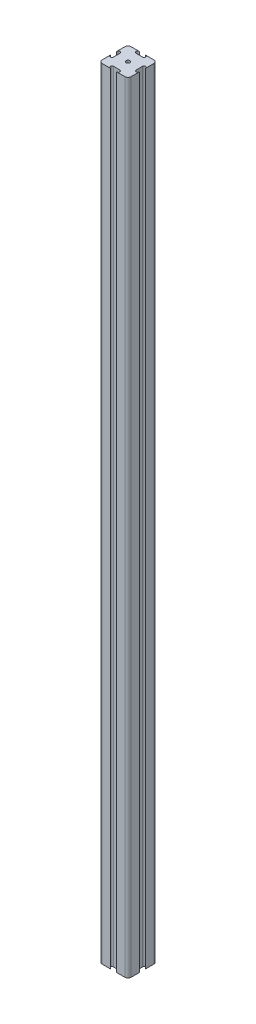
ISO-10303-21;
HEADER;
FILE_DESCRIPTION(('STEP AP214'),'2;1');
FILE_NAME('part.step','',(''),(''),'','','');
FILE_SCHEMA(('AUTOMOTIVE_DESIGN { 1 0 10303 214 1 1 1 1 }'));
ENDSEC;
DATA;
#1=APPLICATION_CONTEXT('core data for automotive mechanical design processes');
#2=APPLICATION_PROTOCOL_DEFINITION('international standard','automotive_design',2000,#1);
#3=PRODUCT_CONTEXT('',#1,'mechanical');
#4=PRODUCT('Part','Part','',(#3));
#5=PRODUCT_RELATED_PRODUCT_CATEGORY('part','',(#4));
#6=PRODUCT_DEFINITION_FORMATION('','',#4);
#7=PRODUCT_DEFINITION_CONTEXT('part definition',#1,'design');
#8=PRODUCT_DEFINITION('design','',#6,#7);
#9=PRODUCT_DEFINITION_SHAPE('','',#8);
#10=(LENGTH_UNIT() NAMED_UNIT(*) SI_UNIT(.MILLI.,.METRE.));
#11=(NAMED_UNIT(*) PLANE_ANGLE_UNIT() SI_UNIT($,.RADIAN.));
#12=(NAMED_UNIT(*) SI_UNIT($,.STERADIAN.) SOLID_ANGLE_UNIT());
#13=UNCERTAINTY_MEASURE_WITH_UNIT(LENGTH_MEASURE(1.E-05),#10,'distance_accuracy_value','');
#14=(GEOMETRIC_REPRESENTATION_CONTEXT(3) GLOBAL_UNCERTAINTY_ASSIGNED_CONTEXT((#13)) GLOBAL_UNIT_ASSIGNED_CONTEXT((#10,
#11,#12)) REPRESENTATION_CONTEXT('',''));
#15=CARTESIAN_POINT('',(0.,0.,0.));
#16=DIRECTION('',(0.,0.,1.));
#17=DIRECTION('',(1.,0.,0.));
#18=AXIS2_PLACEMENT_3D('',#15,#16,#17);
#19=CARTESIAN_POINT('',(-20.,1210.,5.));
#20=DIRECTION('',(0.,-1.,0.));
#21=DIRECTION('',(0.,0.,-1.));
#22=AXIS2_PLACEMENT_3D('',#19,#20,#21);
#23=CYLINDRICAL_SURFACE('',#22,2.5);
#24=CARTESIAN_POINT('',(-20.,0.,5.));
#25=DIRECTION('',(0.,-1.,0.));
#26=DIRECTION('',(0.,0.,-1.));
#27=AXIS2_PLACEMENT_3D('',#24,#25,#26);
#28=CIRCLE('',#27,2.5);
#29=CARTESIAN_POINT('',(-17.5,0.,5.));
#30=VERTEX_POINT('',#29);
#31=CARTESIAN_POINT('',(-22.5,0.,5.));
#32=VERTEX_POINT('',#31);
#33=EDGE_CURVE('E225',#30,#32,#28,.T.);
#34=ORIENTED_EDGE('',*,*,#33,.T.);
#35=DIRECTION('',(0.,-1.,0.));
#36=VECTOR('',#35,1.);
#37=CARTESIAN_POINT('',(-22.5,1210.,5.));
#38=LINE('',#37,#36);
#39=CARTESIAN_POINT('',(-22.5,1210.,5.));
#40=VERTEX_POINT('',#39);
#41=EDGE_CURVE('E11',#40,#32,#38,.T.);
#42=ORIENTED_EDGE('',*,*,#41,.F.);
#43=CARTESIAN_POINT('',(-20.,1210.,5.));
#44=DIRECTION('',(0.,-1.,0.));
#45=DIRECTION('',(0.,0.,-1.));
#46=AXIS2_PLACEMENT_3D('',#43,#44,#45);
#47=CIRCLE('',#46,2.5);
#48=CARTESIAN_POINT('',(-17.5,1210.,5.));
#49=VERTEX_POINT('',#48);
#50=EDGE_CURVE('E290',#49,#40,#47,.T.);
#51=ORIENTED_EDGE('',*,*,#50,.F.);
#52=DIRECTION('',(0.,-1.,0.));
#53=VECTOR('',#52,1.);
#54=CARTESIAN_POINT('',(-17.5,1210.,5.));
#55=LINE('',#54,#53);
#56=EDGE_CURVE('E221',#49,#30,#55,.T.);
#57=ORIENTED_EDGE('',*,*,#56,.T.);
#58=EDGE_LOOP('',(#34,#42,#51,#57));
#59=FACE_BOUND('',#58,.T.);
#60=ADVANCED_FACE('F33',(#59),#23,.F.);
#61=CARTESIAN_POINT('',(-22.5,1210.,5.));
#62=DIRECTION('',(1.,0.,0.));
#63=DIRECTION('',(0.,0.,-1.));
#64=AXIS2_PLACEMENT_3D('',#61,#62,#63);
#65=PLANE('',#64);
#66=DIRECTION('',(0.,0.,1.));
#67=VECTOR('',#66,1.);
#68=CARTESIAN_POINT('',(-22.5,0.,5.));
#69=LINE('',#68,#67);
#70=CARTESIAN_POINT('',(-22.5,0.,17.4999999999999));
#71=VERTEX_POINT('',#70);
#72=EDGE_CURVE('E228',#32,#71,#69,.T.);
#73=ORIENTED_EDGE('',*,*,#72,.T.);
#74=DIRECTION('',(0.,-1.,0.));
#75=VECTOR('',#74,1.);
#76=CARTESIAN_POINT('',(-22.5,1210.,17.4999999999999));
#77=LINE('',#76,#75);
#78=CARTESIAN_POINT('',(-22.5,1210.,17.4999999999999));
#79=VERTEX_POINT('',#78);
#80=EDGE_CURVE('E41',#79,#71,#77,.T.);
#81=ORIENTED_EDGE('',*,*,#80,.F.);
#82=DIRECTION('',(0.,0.,1.));
#83=VECTOR('',#82,1.);
#84=CARTESIAN_POINT('',(-22.5,1210.,5.));
#85=LINE('',#84,#83);
#86=EDGE_CURVE('E136',#40,#79,#85,.T.);
#87=ORIENTED_EDGE('',*,*,#86,.F.);
#88=ORIENTED_EDGE('',*,*,#41,.T.);
#89=EDGE_LOOP('',(#73,#81,#87,#88));
#90=FACE_BOUND('',#89,.T.);
#91=ADVANCED_FACE('F417',(#90),#65,.F.);
#92=CARTESIAN_POINT('',(-17.5,1210.,17.5));
#93=DIRECTION('',(0.,-1.,0.));
#94=DIRECTION('',(0.,0.,-1.));
#95=AXIS2_PLACEMENT_3D('',#92,#93,#94);
#96=CYLINDRICAL_SURFACE('',#95,5.);
#97=CARTESIAN_POINT('',(-17.5,0.,17.5));
#98=DIRECTION('',(0.,1.,0.));
#99=DIRECTION('',(0.,0.,1.));
#100=AXIS2_PLACEMENT_3D('',#97,#98,#99);
#101=CIRCLE('',#100,5.);
#102=CARTESIAN_POINT('',(-17.5,0.,22.5));
#103=VERTEX_POINT('',#102);
#104=EDGE_CURVE('E231',#71,#103,#101,.T.);
#105=ORIENTED_EDGE('',*,*,#104,.T.);
#106=DIRECTION('',(0.,-1.,0.));
#107=VECTOR('',#106,1.);
#108=CARTESIAN_POINT('',(-17.5,1210.,22.5));
#109=LINE('',#108,#107);
#110=CARTESIAN_POINT('',(-17.5,1210.,22.5));
#111=VERTEX_POINT('',#110);
#112=EDGE_CURVE('E329',#111,#103,#109,.T.);
#113=ORIENTED_EDGE('',*,*,#112,.F.);
#114=CARTESIAN_POINT('',(-17.5,1210.,17.5));
#115=DIRECTION('',(0.,1.,0.));
#116=DIRECTION('',(0.,0.,1.));
#117=AXIS2_PLACEMENT_3D('',#114,#115,#116);
#118=CIRCLE('',#117,5.);
#119=EDGE_CURVE('E336',#79,#111,#118,.T.);
#120=ORIENTED_EDGE('',*,*,#119,.F.);
#121=ORIENTED_EDGE('',*,*,#80,.T.);
#122=EDGE_LOOP('',(#105,#113,#120,#121));
#123=FACE_BOUND('',#122,.T.);
#124=ADVANCED_FACE('F334',(#123),#96,.T.);
#125=CARTESIAN_POINT('',(-4.99999999999998,1210.,22.5));
#126=DIRECTION('',(0.,0.,1.));
#127=DIRECTION('',(1.,0.,0.));
#128=AXIS2_PLACEMENT_3D('',#125,#126,#127);
#129=PLANE('',#128);
#130=DIRECTION('',(-1.,0.,0.));
#131=VECTOR('',#130,1.);
#132=CARTESIAN_POINT('',(-4.99999999999998,0.,22.5));
#133=LINE('',#132,#131);
#134=CARTESIAN_POINT('',(-4.99999999999998,0.,22.5));
#135=VERTEX_POINT('',#134);
#136=EDGE_CURVE('E234',#135,#103,#133,.T.);
#137=ORIENTED_EDGE('',*,*,#136,.F.);
#138=DIRECTION('',(0.,-1.,0.));
#139=VECTOR('',#138,1.);
#140=CARTESIAN_POINT('',(-4.99999999999998,1210.,22.5));
#141=LINE('',#140,#139);
#142=CARTESIAN_POINT('',(-4.99999999999998,1210.,22.5));
#143=VERTEX_POINT('',#142);
#144=EDGE_CURVE('E327',#143,#135,#141,.T.);
#145=ORIENTED_EDGE('',*,*,#144,.F.);
#146=DIRECTION('',(-1.,0.,0.));
#147=VECTOR('',#146,1.);
#148=CARTESIAN_POINT('',(-4.99999999999998,1210.,22.5));
#149=LINE('',#148,#147);
#150=EDGE_CURVE('E347',#143,#111,#149,.T.);
#151=ORIENTED_EDGE('',*,*,#150,.T.);
#152=ORIENTED_EDGE('',*,*,#112,.T.);
#153=EDGE_LOOP('',(#137,#145,#151,#152));
#154=FACE_BOUND('',#153,.T.);
#155=ADVANCED_FACE('F344',(#154),#129,.T.);
#156=CARTESIAN_POINT('',(-5.,1210.,20.));
#157=DIRECTION('',(0.,-1.,0.));
#158=DIRECTION('',(0.,0.,-1.));
#159=AXIS2_PLACEMENT_3D('',#156,#157,#158);
#160=CYLINDRICAL_SURFACE('',#159,2.5);
#161=CARTESIAN_POINT('',(-5.,0.,20.));
#162=DIRECTION('',(0.,1.,0.));
#163=DIRECTION('',(0.,0.,1.));
#164=AXIS2_PLACEMENT_3D('',#161,#162,#163);
#165=CIRCLE('',#164,2.5);
#166=CARTESIAN_POINT('',(-4.99999999999998,0.,17.5));
#167=VERTEX_POINT('',#166);
#168=EDGE_CURVE('E237',#167,#135,#165,.T.);
#169=ORIENTED_EDGE('',*,*,#168,.F.);
#170=DIRECTION('',(0.,-1.,0.));
#171=VECTOR('',#170,1.);
#172=CARTESIAN_POINT('',(-4.99999999999998,1210.,17.5));
#173=LINE('',#172,#171);
#174=CARTESIAN_POINT('',(-4.99999999999998,1210.,17.5));
#175=VERTEX_POINT('',#174);
#176=EDGE_CURVE('E325',#175,#167,#173,.T.);
#177=ORIENTED_EDGE('',*,*,#176,.F.);
#178=CARTESIAN_POINT('',(-5.,1210.,20.));
#179=DIRECTION('',(0.,1.,0.));
#180=DIRECTION('',(0.,0.,1.));
#181=AXIS2_PLACEMENT_3D('',#178,#179,#180);
#182=CIRCLE('',#181,2.5);
#183=EDGE_CURVE('E350',#175,#143,#182,.T.);
#184=ORIENTED_EDGE('',*,*,#183,.T.);
#185=ORIENTED_EDGE('',*,*,#144,.T.);
#186=EDGE_LOOP('',(#169,#177,#184,#185));
#187=FACE_BOUND('',#186,.T.);
#188=ADVANCED_FACE('F624',(#187),#160,.F.);
#189=CARTESIAN_POINT('',(-4.99999999999998,1210.,17.5));
#190=DIRECTION('',(0.,0.,-1.));
#191=DIRECTION('',(-1.,0.,0.));
#192=AXIS2_PLACEMENT_3D('',#189,#190,#191);
#193=PLANE('',#192);
#194=DIRECTION('',(1.,0.,0.));
#195=VECTOR('',#194,1.);
#196=CARTESIAN_POINT('',(-4.99999999999998,0.,17.5));
#197=LINE('',#196,#195);
#198=CARTESIAN_POINT('',(5.00000000000002,0.,17.5));
#199=VERTEX_POINT('',#198);
#200=EDGE_CURVE('E240',#167,#199,#197,.T.);
#201=ORIENTED_EDGE('',*,*,#200,.T.);
#202=DIRECTION('',(0.,-1.,0.));
#203=VECTOR('',#202,1.);
#204=CARTESIAN_POINT('',(5.00000000000002,1210.,17.5));
#205=LINE('',#204,#203);
#206=CARTESIAN_POINT('',(5.00000000000002,1210.,17.5));
#207=VERTEX_POINT('',#206);
#208=EDGE_CURVE('E323',#207,#199,#205,.T.);
#209=ORIENTED_EDGE('',*,*,#208,.F.);
#210=DIRECTION('',(1.,0.,0.));
#211=VECTOR('',#210,1.);
#212=CARTESIAN_POINT('',(-4.99999999999998,1210.,17.5));
#213=LINE('',#212,#211);
#214=EDGE_CURVE('E352',#175,#207,#213,.T.);
#215=ORIENTED_EDGE('',*,*,#214,.F.);
#216=ORIENTED_EDGE('',*,*,#176,.T.);
#217=EDGE_LOOP('',(#201,#209,#215,#216));
#218=FACE_BOUND('',#217,.T.);
#219=ADVANCED_FACE('F614',(#218),#193,.F.);
#220=CARTESIAN_POINT('',(4.99999999999996,1210.,20.));
#221=DIRECTION('',(0.,-1.,0.));
#222=DIRECTION('',(0.,0.,-1.));
#223=AXIS2_PLACEMENT_3D('',#220,#221,#222);
#224=CYLINDRICAL_SURFACE('',#223,2.50000000000001);
#225=CARTESIAN_POINT('',(4.99999999999996,0.,20.));
#226=DIRECTION('',(0.,1.,0.));
#227=DIRECTION('',(0.,0.,1.));
#228=AXIS2_PLACEMENT_3D('',#225,#226,#227);
#229=CIRCLE('',#228,2.50000000000001);
#230=CARTESIAN_POINT('',(4.99999999999996,0.,22.5));
#231=VERTEX_POINT('',#230);
#232=EDGE_CURVE('E243',#231,#199,#229,.T.);
#233=ORIENTED_EDGE('',*,*,#232,.F.);
#234=DIRECTION('',(0.,-1.,0.));
#235=VECTOR('',#234,1.);
#236=CARTESIAN_POINT('',(4.99999999999996,1210.,22.5));
#237=LINE('',#236,#235);
#238=CARTESIAN_POINT('',(4.99999999999996,1210.,22.5));
#239=VERTEX_POINT('',#238);
#240=EDGE_CURVE('E321',#239,#231,#237,.T.);
#241=ORIENTED_EDGE('',*,*,#240,.F.);
#242=CARTESIAN_POINT('',(4.99999999999996,1210.,20.));
#243=DIRECTION('',(0.,1.,0.));
#244=DIRECTION('',(0.,0.,1.));
#245=AXIS2_PLACEMENT_3D('',#242,#243,#244);
#246=CIRCLE('',#245,2.50000000000001);
#247=EDGE_CURVE('E358',#239,#207,#246,.T.);
#248=ORIENTED_EDGE('',*,*,#247,.T.);
#249=ORIENTED_EDGE('',*,*,#208,.T.);
#250=EDGE_LOOP('',(#233,#241,#248,#249));
#251=FACE_BOUND('',#250,.T.);
#252=ADVANCED_FACE('F604',(#251),#224,.F.);
#253=CARTESIAN_POINT('',(4.99999999999996,1210.,22.5));
#254=DIRECTION('',(0.,0.,-1.));
#255=DIRECTION('',(-1.,0.,0.));
#256=AXIS2_PLACEMENT_3D('',#253,#254,#255);
#257=PLANE('',#256);
#258=DIRECTION('',(1.,0.,0.));
#259=VECTOR('',#258,1.);
#260=CARTESIAN_POINT('',(4.99999999999996,0.,22.5));
#261=LINE('',#260,#259);
#262=CARTESIAN_POINT('',(17.5,0.,22.5));
#263=VERTEX_POINT('',#262);
#264=EDGE_CURVE('E246',#231,#263,#261,.T.);
#265=ORIENTED_EDGE('',*,*,#264,.T.);
#266=DIRECTION('',(0.,-1.,0.));
#267=VECTOR('',#266,1.);
#268=CARTESIAN_POINT('',(17.5,1210.,22.5));
#269=LINE('',#268,#267);
#270=CARTESIAN_POINT('',(17.5,1210.,22.5));
#271=VERTEX_POINT('',#270);
#272=EDGE_CURVE('E318',#271,#263,#269,.T.);
#273=ORIENTED_EDGE('',*,*,#272,.F.);
#274=DIRECTION('',(1.,0.,0.));
#275=VECTOR('',#274,1.);
#276=CARTESIAN_POINT('',(4.99999999999996,1210.,22.5));
#277=LINE('',#276,#275);
#278=EDGE_CURVE('E361',#239,#271,#277,.T.);
#279=ORIENTED_EDGE('',*,*,#278,.F.);
#280=ORIENTED_EDGE('',*,*,#240,.T.);
#281=EDGE_LOOP('',(#265,#273,#279,#280));
#282=FACE_BOUND('',#281,.T.);
#283=ADVANCED_FACE('F594',(#282),#257,.F.);
#284=CARTESIAN_POINT('',(17.5000000000006,1210.,17.5));
#285=DIRECTION('',(0.,-1.,0.));
#286=DIRECTION('',(0.,0.,-1.));
#287=AXIS2_PLACEMENT_3D('',#284,#285,#286);
#288=CYLINDRICAL_SURFACE('',#287,5.);
#289=CARTESIAN_POINT('',(17.5000000000006,0.,17.5));
#290=DIRECTION('',(0.,1.,0.));
#291=DIRECTION('',(0.,0.,1.));
#292=AXIS2_PLACEMENT_3D('',#289,#290,#291);
#293=CIRCLE('',#292,5.);
#294=CARTESIAN_POINT('',(22.5,0.,17.5000025246919));
#295=VERTEX_POINT('',#294);
#296=EDGE_CURVE('E248',#263,#295,#293,.T.);
#297=ORIENTED_EDGE('',*,*,#296,.T.);
#298=DIRECTION('',(0.,-1.,0.));
#299=VECTOR('',#298,1.);
#300=CARTESIAN_POINT('',(22.5,1210.,17.5000025246919));
#301=LINE('',#300,#299);
#302=CARTESIAN_POINT('',(22.5,1210.,17.5000025246919));
#303=VERTEX_POINT('',#302);
#304=EDGE_CURVE('E316',#303,#295,#301,.T.);
#305=ORIENTED_EDGE('',*,*,#304,.F.);
#306=CARTESIAN_POINT('',(17.5000000000006,1210.,17.5));
#307=DIRECTION('',(0.,1.,0.));
#308=DIRECTION('',(0.,0.,1.));
#309=AXIS2_PLACEMENT_3D('',#306,#307,#308);
#310=CIRCLE('',#309,5.);
#311=EDGE_CURVE('E363',#271,#303,#310,.T.);
#312=ORIENTED_EDGE('',*,*,#311,.F.);
#313=ORIENTED_EDGE('',*,*,#272,.T.);
#314=EDGE_LOOP('',(#297,#305,#312,#313));
#315=FACE_BOUND('',#314,.T.);
#316=ADVANCED_FACE('F584',(#315),#288,.T.);
#317=CARTESIAN_POINT('',(22.5,1210.,5.00000252469196));
#318=DIRECTION('',(1.,0.,0.));
#319=DIRECTION('',(0.,0.,-1.));
#320=AXIS2_PLACEMENT_3D('',#317,#318,#319);
#321=PLANE('',#320);
#322=DIRECTION('',(0.,0.,1.));
#323=VECTOR('',#322,1.);
#324=CARTESIAN_POINT('',(22.5,0.,5.00000252469196));
#325=LINE('',#324,#323);
#326=CARTESIAN_POINT('',(22.5,0.,5.00000252469196));
#327=VERTEX_POINT('',#326);
#328=EDGE_CURVE('E251',#327,#295,#325,.T.);
#329=ORIENTED_EDGE('',*,*,#328,.F.);
#330=DIRECTION('',(0.,-1.,0.));
#331=VECTOR('',#330,1.);
#332=CARTESIAN_POINT('',(22.5,1210.,5.00000252469196));
#333=LINE('',#332,#331);
#334=CARTESIAN_POINT('',(22.5,1210.,5.00000252469196));
#335=VERTEX_POINT('',#334);
#336=EDGE_CURVE('E314',#335,#327,#333,.T.);
#337=ORIENTED_EDGE('',*,*,#336,.F.);
#338=DIRECTION('',(0.,0.,1.));
#339=VECTOR('',#338,1.);
#340=CARTESIAN_POINT('',(22.5,1210.,5.00000252469196));
#341=LINE('',#340,#339);
#342=EDGE_CURVE('E365',#335,#303,#341,.T.);
#343=ORIENTED_EDGE('',*,*,#342,.T.);
#344=ORIENTED_EDGE('',*,*,#304,.T.);
#345=EDGE_LOOP('',(#329,#337,#343,#344));
#346=FACE_BOUND('',#345,.T.);
#347=ADVANCED_FACE('F574',(#346),#321,.T.);
#348=CARTESIAN_POINT('',(20.,1210.,5.00000252469196));
#349=DIRECTION('',(0.,-1.,0.));
#350=DIRECTION('',(0.,0.,-1.));
#351=AXIS2_PLACEMENT_3D('',#348,#349,#350);
#352=CYLINDRICAL_SURFACE('',#351,2.5);
#353=CARTESIAN_POINT('',(20.,0.,5.00000252469196));
#354=DIRECTION('',(0.,-1.,0.));
#355=DIRECTION('',(0.,0.,-1.));
#356=AXIS2_PLACEMENT_3D('',#353,#354,#355);
#357=CIRCLE('',#356,2.5);
#358=CARTESIAN_POINT('',(17.5,0.,5.00000252469196));
#359=VERTEX_POINT('',#358);
#360=EDGE_CURVE('E254',#327,#359,#357,.T.);
#361=ORIENTED_EDGE('',*,*,#360,.T.);
#362=DIRECTION('',(0.,-1.,0.));
#363=VECTOR('',#362,1.);
#364=CARTESIAN_POINT('',(17.5,1210.,5.00000252469196));
#365=LINE('',#364,#363);
#366=CARTESIAN_POINT('',(17.5,1210.,5.00000252469196));
#367=VERTEX_POINT('',#366);
#368=EDGE_CURVE('E312',#367,#359,#365,.T.);
#369=ORIENTED_EDGE('',*,*,#368,.F.);
#370=CARTESIAN_POINT('',(20.,1210.,5.00000252469196));
#371=DIRECTION('',(0.,-1.,0.));
#372=DIRECTION('',(0.,0.,-1.));
#373=AXIS2_PLACEMENT_3D('',#370,#371,#372);
#374=CIRCLE('',#373,2.5);
#375=EDGE_CURVE('E368',#335,#367,#374,.T.);
#376=ORIENTED_EDGE('',*,*,#375,.F.);
#377=ORIENTED_EDGE('',*,*,#336,.T.);
#378=EDGE_LOOP('',(#361,#369,#376,#377));
#379=FACE_BOUND('',#378,.T.);
#380=ADVANCED_FACE('F564',(#379),#352,.F.);
#381=CARTESIAN_POINT('',(17.5,1210.,-4.99999747530804));
#382=DIRECTION('',(1.,0.,0.));
#383=DIRECTION('',(0.,0.,-1.));
#384=AXIS2_PLACEMENT_3D('',#381,#382,#383);
#385=PLANE('',#384);
#386=DIRECTION('',(0.,0.,1.));
#387=VECTOR('',#386,1.);
#388=CARTESIAN_POINT('',(17.5,0.,-4.99999747530804));
#389=LINE('',#388,#387);
#390=CARTESIAN_POINT('',(17.5,0.,-4.99999747530804));
#391=VERTEX_POINT('',#390);
#392=EDGE_CURVE('E257',#391,#359,#389,.T.);
#393=ORIENTED_EDGE('',*,*,#392,.F.);
#394=DIRECTION('',(0.,-1.,0.));
#395=VECTOR('',#394,1.);
#396=CARTESIAN_POINT('',(17.5,1210.,-4.99999747530804));
#397=LINE('',#396,#395);
#398=CARTESIAN_POINT('',(17.5,1210.,-4.99999747530804));
#399=VERTEX_POINT('',#398);
#400=EDGE_CURVE('E310',#399,#391,#397,.T.);
#401=ORIENTED_EDGE('',*,*,#400,.F.);
#402=DIRECTION('',(0.,0.,1.));
#403=VECTOR('',#402,1.);
#404=CARTESIAN_POINT('',(17.5,1210.,-4.99999747530804));
#405=LINE('',#404,#403);
#406=EDGE_CURVE('E370',#399,#367,#405,.T.);
#407=ORIENTED_EDGE('',*,*,#406,.T.);
#408=ORIENTED_EDGE('',*,*,#368,.T.);
#409=EDGE_LOOP('',(#393,#401,#407,#408));
#410=FACE_BOUND('',#409,.T.);
#411=ADVANCED_FACE('F554',(#410),#385,.T.);
#412=CARTESIAN_POINT('',(20.,1210.,-4.99999747530804));
#413=DIRECTION('',(0.,-1.,0.));
#414=DIRECTION('',(0.,0.,-1.));
#415=AXIS2_PLACEMENT_3D('',#412,#413,#414);
#416=CYLINDRICAL_SURFACE('',#415,2.5);
#417=CARTESIAN_POINT('',(20.,0.,-4.99999747530804));
#418=DIRECTION('',(0.,1.,0.));
#419=DIRECTION('',(0.,0.,1.));
#420=AXIS2_PLACEMENT_3D('',#417,#418,#419);
#421=CIRCLE('',#420,2.5);
#422=CARTESIAN_POINT('',(22.5,0.,-4.99999747530804));
#423=VERTEX_POINT('',#422);
#424=EDGE_CURVE('E260',#423,#391,#421,.T.);
#425=ORIENTED_EDGE('',*,*,#424,.F.);
#426=DIRECTION('',(0.,-1.,0.));
#427=VECTOR('',#426,1.);
#428=CARTESIAN_POINT('',(22.5,1210.,-4.99999747530804));
#429=LINE('',#428,#427);
#430=CARTESIAN_POINT('',(22.5,1210.,-4.99999747530804));
#431=VERTEX_POINT('',#430);
#432=EDGE_CURVE('E308',#431,#423,#429,.T.);
#433=ORIENTED_EDGE('',*,*,#432,.F.);
#434=CARTESIAN_POINT('',(20.,1210.,-4.99999747530804));
#435=DIRECTION('',(0.,1.,0.));
#436=DIRECTION('',(0.,0.,1.));
#437=AXIS2_PLACEMENT_3D('',#434,#435,#436);
#438=CIRCLE('',#437,2.5);
#439=EDGE_CURVE('E373',#431,#399,#438,.T.);
#440=ORIENTED_EDGE('',*,*,#439,.T.);
#441=ORIENTED_EDGE('',*,*,#400,.T.);
#442=EDGE_LOOP('',(#425,#433,#440,#441));
#443=FACE_BOUND('',#442,.T.);
#444=ADVANCED_FACE('F544',(#443),#416,.F.);
#445=CARTESIAN_POINT('',(22.5,1210.,-4.99999747530804));
#446=DIRECTION('',(-1.,0.,0.));
#447=DIRECTION('',(0.,0.,1.));
#448=AXIS2_PLACEMENT_3D('',#445,#446,#447);
#449=PLANE('',#448);
#450=DIRECTION('',(0.,0.,-1.));
#451=VECTOR('',#450,1.);
#452=CARTESIAN_POINT('',(22.5,0.,-4.99999747530804));
#453=LINE('',#452,#451);
#454=CARTESIAN_POINT('',(22.5,0.,-17.499997475308));
#455=VERTEX_POINT('',#454);
#456=EDGE_CURVE('E263',#423,#455,#453,.T.);
#457=ORIENTED_EDGE('',*,*,#456,.T.);
#458=DIRECTION('',(0.,-1.,0.));
#459=VECTOR('',#458,1.);
#460=CARTESIAN_POINT('',(22.5,1210.,-17.499997475308));
#461=LINE('',#460,#459);
#462=CARTESIAN_POINT('',(22.5,1210.,-17.499997475308));
#463=VERTEX_POINT('',#462);
#464=EDGE_CURVE('E306',#463,#455,#461,.T.);
#465=ORIENTED_EDGE('',*,*,#464,.F.);
#466=DIRECTION('',(0.,0.,-1.));
#467=VECTOR('',#466,1.);
#468=CARTESIAN_POINT('',(22.5,1210.,-4.99999747530804));
#469=LINE('',#468,#467);
#470=EDGE_CURVE('E376',#431,#463,#469,.T.);
#471=ORIENTED_EDGE('',*,*,#470,.F.);
#472=ORIENTED_EDGE('',*,*,#432,.T.);
#473=EDGE_LOOP('',(#457,#465,#471,#472));
#474=FACE_BOUND('',#473,.T.);
#475=ADVANCED_FACE('F534',(#474),#449,.F.);
#476=CARTESIAN_POINT('',(17.5000000000006,1210.,-17.5));
#477=DIRECTION('',(0.,-1.,0.));
#478=DIRECTION('',(0.,0.,-1.));
#479=AXIS2_PLACEMENT_3D('',#476,#477,#478);
#480=CYLINDRICAL_SURFACE('',#479,5.00000000000001);
#481=CARTESIAN_POINT('',(17.5000000000006,0.,-17.5));
#482=DIRECTION('',(0.,-1.,0.));
#483=DIRECTION('',(0.,0.,-1.));
#484=AXIS2_PLACEMENT_3D('',#481,#482,#483);
#485=CIRCLE('',#484,5.00000000000001);
#486=CARTESIAN_POINT('',(17.5,0.,-22.5));
#487=VERTEX_POINT('',#486);
#488=EDGE_CURVE('E266',#487,#455,#485,.T.);
#489=ORIENTED_EDGE('',*,*,#488,.F.);
#490=DIRECTION('',(0.,-1.,0.));
#491=VECTOR('',#490,1.);
#492=CARTESIAN_POINT('',(17.5,1210.,-22.5));
#493=LINE('',#492,#491);
#494=CARTESIAN_POINT('',(17.5,1210.,-22.5));
#495=VERTEX_POINT('',#494);
#496=EDGE_CURVE('E304',#495,#487,#493,.T.);
#497=ORIENTED_EDGE('',*,*,#496,.F.);
#498=CARTESIAN_POINT('',(17.5000000000006,1210.,-17.5));
#499=DIRECTION('',(0.,-1.,0.));
#500=DIRECTION('',(0.,0.,-1.));
#501=AXIS2_PLACEMENT_3D('',#498,#499,#500);
#502=CIRCLE('',#501,5.00000000000001);
#503=EDGE_CURVE('E378',#495,#463,#502,.T.);
#504=ORIENTED_EDGE('',*,*,#503,.T.);
#505=ORIENTED_EDGE('',*,*,#464,.T.);
#506=EDGE_LOOP('',(#489,#497,#504,#505));
#507=FACE_BOUND('',#506,.T.);
#508=ADVANCED_FACE('F524',(#507),#480,.T.);
#509=CARTESIAN_POINT('',(5.00000000000003,1210.,-22.5));
#510=DIRECTION('',(0.,0.,-1.));
#511=DIRECTION('',(-1.,0.,0.));
#512=AXIS2_PLACEMENT_3D('',#509,#510,#511);
#513=PLANE('',#512);
#514=DIRECTION('',(1.,0.,0.));
#515=VECTOR('',#514,1.);
#516=CARTESIAN_POINT('',(5.00000000000003,0.,-22.5));
#517=LINE('',#516,#515);
#518=CARTESIAN_POINT('',(5.00000000000003,0.,-22.5));
#519=VERTEX_POINT('',#518);
#520=EDGE_CURVE('E269',#519,#487,#517,.T.);
#521=ORIENTED_EDGE('',*,*,#520,.F.);
#522=DIRECTION('',(0.,-1.,0.));
#523=VECTOR('',#522,1.);
#524=CARTESIAN_POINT('',(5.00000000000003,1210.,-22.5));
#525=LINE('',#524,#523);
#526=CARTESIAN_POINT('',(5.00000000000003,1210.,-22.5));
#527=VERTEX_POINT('',#526);
#528=EDGE_CURVE('E302',#527,#519,#525,.T.);
#529=ORIENTED_EDGE('',*,*,#528,.F.);
#530=DIRECTION('',(1.,0.,0.));
#531=VECTOR('',#530,1.);
#532=CARTESIAN_POINT('',(5.00000000000003,1210.,-22.5));
#533=LINE('',#532,#531);
#534=EDGE_CURVE('E381',#527,#495,#533,.T.);
#535=ORIENTED_EDGE('',*,*,#534,.T.);
#536=ORIENTED_EDGE('',*,*,#496,.T.);
#537=EDGE_LOOP('',(#521,#529,#535,#536));
#538=FACE_BOUND('',#537,.T.);
#539=ADVANCED_FACE('F514',(#538),#513,.T.);
#540=CARTESIAN_POINT('',(5.00000000000003,1210.,-20.));
#541=DIRECTION('',(0.,-1.,0.));
#542=DIRECTION('',(0.,0.,-1.));
#543=AXIS2_PLACEMENT_3D('',#540,#541,#542);
#544=CYLINDRICAL_SURFACE('',#543,2.50000000000001);
#545=CARTESIAN_POINT('',(5.00000000000003,0.,-20.));
#546=DIRECTION('',(0.,1.,0.));
#547=DIRECTION('',(0.,0.,1.));
#548=AXIS2_PLACEMENT_3D('',#545,#546,#547);
#549=CIRCLE('',#548,2.50000000000001);
#550=CARTESIAN_POINT('',(5.00000000000001,0.,-17.5));
#551=VERTEX_POINT('',#550);
#552=EDGE_CURVE('E272',#551,#519,#549,.T.);
#553=ORIENTED_EDGE('',*,*,#552,.F.);
#554=DIRECTION('',(0.,-1.,0.));
#555=VECTOR('',#554,1.);
#556=CARTESIAN_POINT('',(5.00000000000001,1210.,-17.5));
#557=LINE('',#556,#555);
#558=CARTESIAN_POINT('',(5.00000000000001,1210.,-17.5));
#559=VERTEX_POINT('',#558);
#560=EDGE_CURVE('E300',#559,#551,#557,.T.);
#561=ORIENTED_EDGE('',*,*,#560,.F.);
#562=CARTESIAN_POINT('',(5.00000000000003,1210.,-20.));
#563=DIRECTION('',(0.,1.,0.));
#564=DIRECTION('',(0.,0.,1.));
#565=AXIS2_PLACEMENT_3D('',#562,#563,#564);
#566=CIRCLE('',#565,2.50000000000001);
#567=EDGE_CURVE('E384',#559,#527,#566,.T.);
#568=ORIENTED_EDGE('',*,*,#567,.T.);
#569=ORIENTED_EDGE('',*,*,#528,.T.);
#570=EDGE_LOOP('',(#553,#561,#568,#569));
#571=FACE_BOUND('',#570,.T.);
#572=ADVANCED_FACE('F504',(#571),#544,.F.);
#573=CARTESIAN_POINT('',(-5.,1210.,-17.5));
#574=DIRECTION('',(0.,0.,-1.));
#575=DIRECTION('',(-1.,0.,0.));
#576=AXIS2_PLACEMENT_3D('',#573,#574,#575);
#577=PLANE('',#576);
#578=DIRECTION('',(1.,0.,0.));
#579=VECTOR('',#578,1.);
#580=CARTESIAN_POINT('',(-5.,0.,-17.5));
#581=LINE('',#580,#579);
#582=CARTESIAN_POINT('',(-5.,0.,-17.5));
#583=VERTEX_POINT('',#582);
#584=EDGE_CURVE('E275',#583,#551,#581,.T.);
#585=ORIENTED_EDGE('',*,*,#584,.F.);
#586=DIRECTION('',(0.,-1.,0.));
#587=VECTOR('',#586,1.);
#588=CARTESIAN_POINT('',(-5.,1210.,-17.5));
#589=LINE('',#588,#587);
#590=CARTESIAN_POINT('',(-5.,1210.,-17.5));
#591=VERTEX_POINT('',#590);
#592=EDGE_CURVE('E298',#591,#583,#589,.T.);
#593=ORIENTED_EDGE('',*,*,#592,.F.);
#594=DIRECTION('',(1.,0.,0.));
#595=VECTOR('',#594,1.);
#596=CARTESIAN_POINT('',(-5.,1210.,-17.5));
#597=LINE('',#596,#595);
#598=EDGE_CURVE('E387',#591,#559,#597,.T.);
#599=ORIENTED_EDGE('',*,*,#598,.T.);
#600=ORIENTED_EDGE('',*,*,#560,.T.);
#601=EDGE_LOOP('',(#585,#593,#599,#600));
#602=FACE_BOUND('',#601,.T.);
#603=ADVANCED_FACE('F495',(#602),#577,.T.);
#604=CARTESIAN_POINT('',(-5.00000000000003,1210.,-20.));
#605=DIRECTION('',(0.,-1.,0.));
#606=DIRECTION('',(0.,0.,-1.));
#607=AXIS2_PLACEMENT_3D('',#604,#605,#606);
#608=CYLINDRICAL_SURFACE('',#607,2.5);
#609=CARTESIAN_POINT('',(-5.00000000000003,0.,-20.));
#610=DIRECTION('',(0.,1.,0.));
#611=DIRECTION('',(0.,0.,1.));
#612=AXIS2_PLACEMENT_3D('',#609,#610,#611);
#613=CIRCLE('',#612,2.5);
#614=CARTESIAN_POINT('',(-5.00000000000003,0.,-22.5));
#615=VERTEX_POINT('',#614);
#616=EDGE_CURVE('E278',#615,#583,#613,.T.);
#617=ORIENTED_EDGE('',*,*,#616,.F.);
#618=DIRECTION('',(0.,-1.,0.));
#619=VECTOR('',#618,1.);
#620=CARTESIAN_POINT('',(-5.00000000000003,1210.,-22.5));
#621=LINE('',#620,#619);
#622=CARTESIAN_POINT('',(-5.00000000000003,1210.,-22.5));
#623=VERTEX_POINT('',#622);
#624=EDGE_CURVE('E296',#623,#615,#621,.T.);
#625=ORIENTED_EDGE('',*,*,#624,.F.);
#626=CARTESIAN_POINT('',(-5.00000000000003,1210.,-20.));
#627=DIRECTION('',(0.,1.,0.));
#628=DIRECTION('',(0.,0.,1.));
#629=AXIS2_PLACEMENT_3D('',#626,#627,#628);
#630=CIRCLE('',#629,2.5);
#631=EDGE_CURVE('E390',#623,#591,#630,.T.);
#632=ORIENTED_EDGE('',*,*,#631,.T.);
#633=ORIENTED_EDGE('',*,*,#592,.T.);
#634=EDGE_LOOP('',(#617,#625,#632,#633));
#635=FACE_BOUND('',#634,.T.);
#636=ADVANCED_FACE('F403',(#635),#608,.F.);
#637=CARTESIAN_POINT('',(-17.5,1210.,-22.5));
#638=DIRECTION('',(0.,0.,-1.));
#639=DIRECTION('',(-1.,0.,0.));
#640=AXIS2_PLACEMENT_3D('',#637,#638,#639);
#641=PLANE('',#640);
#642=DIRECTION('',(1.,0.,0.));
#643=VECTOR('',#642,1.);
#644=CARTESIAN_POINT('',(-17.5,0.,-22.5));
#645=LINE('',#644,#643);
#646=CARTESIAN_POINT('',(-17.5,0.,-22.5));
#647=VERTEX_POINT('',#646);
#648=EDGE_CURVE('E281',#647,#615,#645,.T.);
#649=ORIENTED_EDGE('',*,*,#648,.F.);
#650=DIRECTION('',(0.,-1.,0.));
#651=VECTOR('',#650,1.);
#652=CARTESIAN_POINT('',(-17.5,1210.,-22.5));
#653=LINE('',#652,#651);
#654=CARTESIAN_POINT('',(-17.5,1210.,-22.5));
#655=VERTEX_POINT('',#654);
#656=EDGE_CURVE('E294',#655,#647,#653,.T.);
#657=ORIENTED_EDGE('',*,*,#656,.F.);
#658=DIRECTION('',(1.,0.,0.));
#659=VECTOR('',#658,1.);
#660=CARTESIAN_POINT('',(-17.5,1210.,-22.5));
#661=LINE('',#660,#659);
#662=EDGE_CURVE('E393',#655,#623,#661,.T.);
#663=ORIENTED_EDGE('',*,*,#662,.T.);
#664=ORIENTED_EDGE('',*,*,#624,.T.);
#665=EDGE_LOOP('',(#649,#657,#663,#664));
#666=FACE_BOUND('',#665,.T.);
#667=ADVANCED_FACE('F397',(#666),#641,.T.);
#668=CARTESIAN_POINT('',(-17.5,1210.,-17.5));
#669=DIRECTION('',(0.,-1.,0.));
#670=DIRECTION('',(0.,0.,-1.));
#671=AXIS2_PLACEMENT_3D('',#668,#669,#670);
#672=CYLINDRICAL_SURFACE('',#671,5.00000000000001);
#673=CARTESIAN_POINT('',(-17.5,0.,-17.5));
#674=DIRECTION('',(0.,1.,0.));
#675=DIRECTION('',(0.,0.,1.));
#676=AXIS2_PLACEMENT_3D('',#673,#674,#675);
#677=CIRCLE('',#676,5.00000000000001);
#678=CARTESIAN_POINT('',(-22.5,0.,-17.5));
#679=VERTEX_POINT('',#678);
#680=EDGE_CURVE('E284',#647,#679,#677,.T.);
#681=ORIENTED_EDGE('',*,*,#680,.T.);
#682=DIRECTION('',(0.,-1.,0.));
#683=VECTOR('',#682,1.);
#684=CARTESIAN_POINT('',(-22.5,1210.,-17.5));
#685=LINE('',#684,#683);
#686=CARTESIAN_POINT('',(-22.5,1210.,-17.5));
#687=VERTEX_POINT('',#686);
#688=EDGE_CURVE('E217',#687,#679,#685,.T.);
#689=ORIENTED_EDGE('',*,*,#688,.F.);
#690=CARTESIAN_POINT('',(-17.5,1210.,-17.5));
#691=DIRECTION('',(0.,1.,0.));
#692=DIRECTION('',(0.,0.,1.));
#693=AXIS2_PLACEMENT_3D('',#690,#691,#692);
#694=CIRCLE('',#693,5.00000000000001);
#695=EDGE_CURVE('E204',#655,#687,#694,.T.);
#696=ORIENTED_EDGE('',*,*,#695,.F.);
#697=ORIENTED_EDGE('',*,*,#656,.T.);
#698=EDGE_LOOP('',(#681,#689,#696,#697));
#699=FACE_BOUND('',#698,.T.);
#700=ADVANCED_FACE('F407',(#699),#672,.T.);
#701=CARTESIAN_POINT('',(-22.5,1210.,-17.5));
#702=DIRECTION('',(1.,0.,0.));
#703=DIRECTION('',(0.,0.,-1.));
#704=AXIS2_PLACEMENT_3D('',#701,#702,#703);
#705=PLANE('',#704);
#706=DIRECTION('',(0.,0.,1.));
#707=VECTOR('',#706,1.);
#708=CARTESIAN_POINT('',(-22.5,0.,-17.5));
#709=LINE('',#708,#707);
#710=CARTESIAN_POINT('',(-22.5,0.,-5.));
#711=VERTEX_POINT('',#710);
#712=EDGE_CURVE('E213',#679,#711,#709,.T.);
#713=ORIENTED_EDGE('',*,*,#712,.T.);
#714=DIRECTION('',(0.,-1.,0.));
#715=VECTOR('',#714,1.);
#716=CARTESIAN_POINT('',(-22.5,1210.,-5.));
#717=LINE('',#716,#715);
#718=CARTESIAN_POINT('',(-22.5,1210.,-5.));
#719=VERTEX_POINT('',#718);
#720=EDGE_CURVE('E210',#719,#711,#717,.T.);
#721=ORIENTED_EDGE('',*,*,#720,.F.);
#722=DIRECTION('',(0.,0.,1.));
#723=VECTOR('',#722,1.);
#724=CARTESIAN_POINT('',(-22.5,1210.,-17.5));
#725=LINE('',#724,#723);
#726=EDGE_CURVE('E197',#687,#719,#725,.T.);
#727=ORIENTED_EDGE('',*,*,#726,.F.);
#728=ORIENTED_EDGE('',*,*,#688,.T.);
#729=EDGE_LOOP('',(#713,#721,#727,#728));
#730=FACE_BOUND('',#729,.T.);
#731=ADVANCED_FACE('F211',(#730),#705,.F.);
#732=CARTESIAN_POINT('',(-20.,1210.,-5.));
#733=DIRECTION('',(0.,-1.,0.));
#734=DIRECTION('',(0.,0.,-1.));
#735=AXIS2_PLACEMENT_3D('',#732,#733,#734);
#736=CYLINDRICAL_SURFACE('',#735,2.5);
#737=CARTESIAN_POINT('',(-20.,0.,-5.));
#738=DIRECTION('',(0.,1.,0.));
#739=DIRECTION('',(0.,0.,1.));
#740=AXIS2_PLACEMENT_3D('',#737,#738,#739);
#741=CIRCLE('',#740,2.5);
#742=CARTESIAN_POINT('',(-17.5,0.,-5.));
#743=VERTEX_POINT('',#742);
#744=EDGE_CURVE('E287',#743,#711,#741,.T.);
#745=ORIENTED_EDGE('',*,*,#744,.F.);
#746=DIRECTION('',(0.,-1.,0.));
#747=VECTOR('',#746,1.);
#748=CARTESIAN_POINT('',(-17.5,1210.,-5.));
#749=LINE('',#748,#747);
#750=CARTESIAN_POINT('',(-17.5,1210.,-5.));
#751=VERTEX_POINT('',#750);
#752=EDGE_CURVE('E125',#751,#743,#749,.T.);
#753=ORIENTED_EDGE('',*,*,#752,.F.);
#754=CARTESIAN_POINT('',(-20.,1210.,-5.));
#755=DIRECTION('',(0.,1.,0.));
#756=DIRECTION('',(0.,0.,1.));
#757=AXIS2_PLACEMENT_3D('',#754,#755,#756);
#758=CIRCLE('',#757,2.5);
#759=EDGE_CURVE('E201',#751,#719,#758,.T.);
#760=ORIENTED_EDGE('',*,*,#759,.T.);
#761=ORIENTED_EDGE('',*,*,#720,.T.);
#762=EDGE_LOOP('',(#745,#753,#760,#761));
#763=FACE_BOUND('',#762,.T.);
#764=ADVANCED_FACE('F219',(#763),#736,.F.);
#765=CARTESIAN_POINT('',(-17.5,1210.,-5.));
#766=DIRECTION('',(1.,0.,0.));
#767=DIRECTION('',(0.,0.,-1.));
#768=AXIS2_PLACEMENT_3D('',#765,#766,#767);
#769=PLANE('',#768);
#770=DIRECTION('',(0.,0.,1.));
#771=VECTOR('',#770,1.);
#772=CARTESIAN_POINT('',(-17.5,0.,-5.));
#773=LINE('',#772,#771);
#774=EDGE_CURVE('E128',#743,#30,#773,.T.);
#775=ORIENTED_EDGE('',*,*,#774,.T.);
#776=ORIENTED_EDGE('',*,*,#56,.F.);
#777=DIRECTION('',(0.,0.,1.));
#778=VECTOR('',#777,1.);
#779=CARTESIAN_POINT('',(-17.5,1210.,-5.));
#780=LINE('',#779,#778);
#781=EDGE_CURVE('E49',#751,#49,#780,.T.);
#782=ORIENTED_EDGE('',*,*,#781,.F.);
#783=ORIENTED_EDGE('',*,*,#752,.T.);
#784=EDGE_LOOP('',(#775,#776,#782,#783));
#785=FACE_BOUND('',#784,.T.);
#786=ADVANCED_FACE('F424',(#785),#769,.F.);
#787=CARTESIAN_POINT('',(-20.,1210.,5.));
#788=DIRECTION('',(0.,-1.,0.));
#789=DIRECTION('',(0.,0.,-1.));
#790=AXIS2_PLACEMENT_3D('',#787,#788,#789);
#791=PLANE('',#790);
#792=CARTESIAN_POINT('',(0.,1210.,0.));
#793=DIRECTION('',(0.,-1.,0.));
#794=DIRECTION('',(0.,0.,-1.));
#795=AXIS2_PLACEMENT_3D('',#792,#793,#794);
#796=CIRCLE('',#795,3.);
#797=CARTESIAN_POINT('',(0.,1210.,-3.));
#798=VERTEX_POINT('',#797);
#799=EDGE_CURVE('E229',#798,#798,#796,.T.);
#800=ORIENTED_EDGE('',*,*,#799,.T.);
#801=EDGE_LOOP('',(#800));
#802=FACE_BOUND('',#801,.T.);
#803=ORIENTED_EDGE('',*,*,#50,.T.);
#804=ORIENTED_EDGE('',*,*,#86,.T.);
#805=ORIENTED_EDGE('',*,*,#119,.T.);
#806=ORIENTED_EDGE('',*,*,#150,.F.);
#807=ORIENTED_EDGE('',*,*,#183,.F.);
#808=ORIENTED_EDGE('',*,*,#214,.T.);
#809=ORIENTED_EDGE('',*,*,#247,.F.);
#810=ORIENTED_EDGE('',*,*,#278,.T.);
#811=ORIENTED_EDGE('',*,*,#311,.T.);
#812=ORIENTED_EDGE('',*,*,#342,.F.);
#813=ORIENTED_EDGE('',*,*,#375,.T.);
#814=ORIENTED_EDGE('',*,*,#406,.F.);
#815=ORIENTED_EDGE('',*,*,#439,.F.);
#816=ORIENTED_EDGE('',*,*,#470,.T.);
#817=ORIENTED_EDGE('',*,*,#503,.F.);
#818=ORIENTED_EDGE('',*,*,#534,.F.);
#819=ORIENTED_EDGE('',*,*,#567,.F.);
#820=ORIENTED_EDGE('',*,*,#598,.F.);
#821=ORIENTED_EDGE('',*,*,#631,.F.);
#822=ORIENTED_EDGE('',*,*,#662,.F.);
#823=ORIENTED_EDGE('',*,*,#695,.T.);
#824=ORIENTED_EDGE('',*,*,#726,.T.);
#825=ORIENTED_EDGE('',*,*,#759,.F.);
#826=ORIENTED_EDGE('',*,*,#781,.T.);
#827=EDGE_LOOP('',(#803,#804,#805,#806,#807,#808,#809,#810,#811,#812,#813,#814,#815,#816,#817,
#818,#819,#820,#821,#822,#823,#824,#825,#826));
#828=FACE_BOUND('',#827,.T.);
#829=ADVANCED_FACE('F199',(#802,#828),#791,.F.);
#830=CARTESIAN_POINT('',(-20.,0.,5.));
#831=DIRECTION('',(0.,-1.,0.));
#832=DIRECTION('',(0.,0.,-1.));
#833=AXIS2_PLACEMENT_3D('',#830,#831,#832);
#834=PLANE('',#833);
#835=CARTESIAN_POINT('',(0.,0.,0.));
#836=DIRECTION('',(0.,-1.,0.));
#837=DIRECTION('',(0.,0.,-1.));
#838=AXIS2_PLACEMENT_3D('',#835,#836,#837);
#839=CIRCLE('',#838,3.);
#840=CARTESIAN_POINT('',(0.,0.,-3.));
#841=VERTEX_POINT('',#840);
#842=EDGE_CURVE('E448',#841,#841,#839,.T.);
#843=ORIENTED_EDGE('',*,*,#842,.F.);
#844=EDGE_LOOP('',(#843));
#845=FACE_BOUND('',#844,.T.);
#846=ORIENTED_EDGE('',*,*,#33,.F.);
#847=ORIENTED_EDGE('',*,*,#774,.F.);
#848=ORIENTED_EDGE('',*,*,#744,.T.);
#849=ORIENTED_EDGE('',*,*,#712,.F.);
#850=ORIENTED_EDGE('',*,*,#680,.F.);
#851=ORIENTED_EDGE('',*,*,#648,.T.);
#852=ORIENTED_EDGE('',*,*,#616,.T.);
#853=ORIENTED_EDGE('',*,*,#584,.T.);
#854=ORIENTED_EDGE('',*,*,#552,.T.);
#855=ORIENTED_EDGE('',*,*,#520,.T.);
#856=ORIENTED_EDGE('',*,*,#488,.T.);
#857=ORIENTED_EDGE('',*,*,#456,.F.);
#858=ORIENTED_EDGE('',*,*,#424,.T.);
#859=ORIENTED_EDGE('',*,*,#392,.T.);
#860=ORIENTED_EDGE('',*,*,#360,.F.);
#861=ORIENTED_EDGE('',*,*,#328,.T.);
#862=ORIENTED_EDGE('',*,*,#296,.F.);
#863=ORIENTED_EDGE('',*,*,#264,.F.);
#864=ORIENTED_EDGE('',*,*,#232,.T.);
#865=ORIENTED_EDGE('',*,*,#200,.F.);
#866=ORIENTED_EDGE('',*,*,#168,.T.);
#867=ORIENTED_EDGE('',*,*,#136,.T.);
#868=ORIENTED_EDGE('',*,*,#104,.F.);
#869=ORIENTED_EDGE('',*,*,#72,.F.);
#870=EDGE_LOOP('',(#846,#847,#848,#849,#850,#851,#852,#853,#854,#855,#856,#857,#858,#859,#860,
#861,#862,#863,#864,#865,#866,#867,#868,#869));
#871=FACE_BOUND('',#870,.T.);
#872=ADVANCED_FACE('F339',(#845,#871),#834,.T.);
#873=CARTESIAN_POINT('',(0.,1210.,0.));
#874=DIRECTION('',(0.,-1.,0.));
#875=DIRECTION('',(0.,0.,-1.));
#876=AXIS2_PLACEMENT_3D('',#873,#874,#875);
#877=CYLINDRICAL_SURFACE('',#876,3.);
#878=ORIENTED_EDGE('',*,*,#799,.F.);
#879=EDGE_LOOP('',(#878));
#880=FACE_BOUND('',#879,.T.);
#881=ORIENTED_EDGE('',*,*,#842,.T.);
#882=EDGE_LOOP('',(#881));
#883=FACE_BOUND('',#882,.T.);
#884=ADVANCED_FACE('F436',(#880,#883),#877,.F.);
#885=CLOSED_SHELL('',(#60,#91,#124,#155,#188,#219,#252,#283,#316,#347,#380,#411,#444,#475,#508,
#539,#572,#603,#636,#667,#700,#731,#764,#786,#829,#872,#884));
#886=MANIFOLD_SOLID_BREP('B2',#885);
#887=ADVANCED_BREP_SHAPE_REPRESENTATION('',(#18,#886),#14);
#888=SHAPE_DEFINITION_REPRESENTATION(#9,#887);
ENDSEC;
END-ISO-10303-21;
